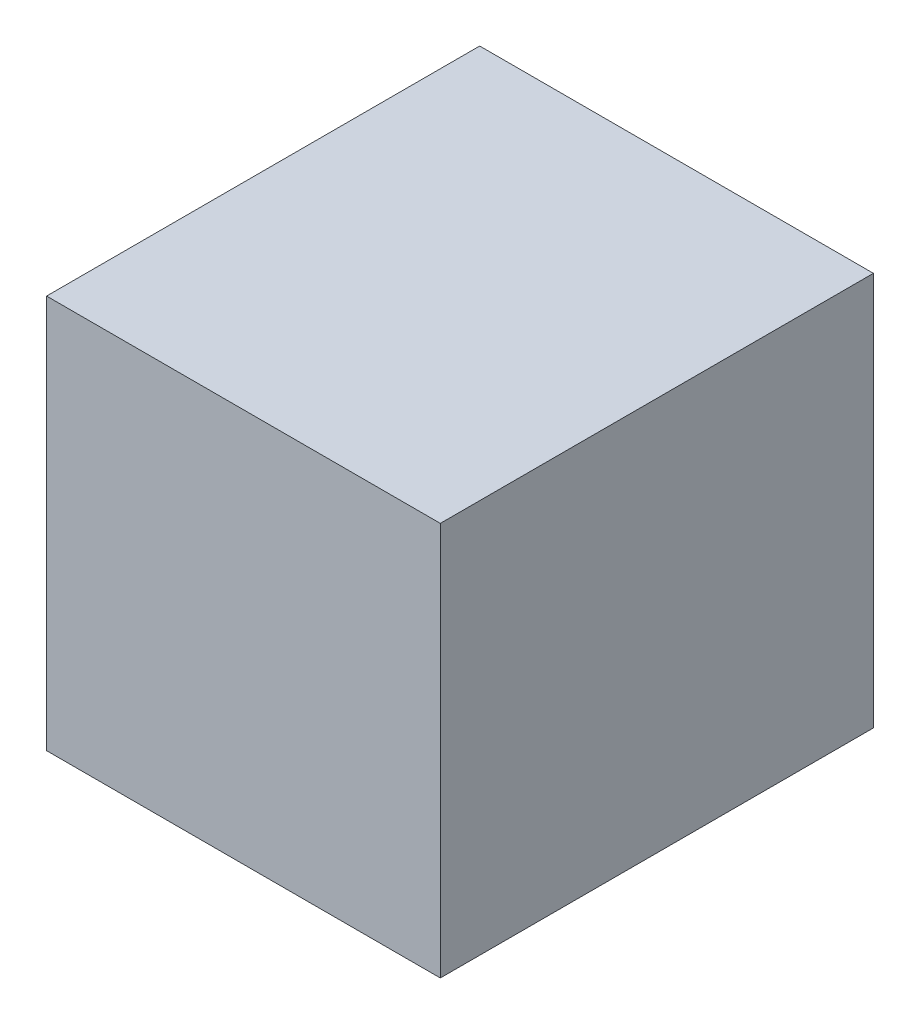
ISO-10303-21;
HEADER;
FILE_DESCRIPTION(('STEP AP214'),'2;1');
FILE_NAME('part.step','',(''),(''),'','','');
FILE_SCHEMA(('AUTOMOTIVE_DESIGN { 1 0 10303 214 1 1 1 1 }'));
ENDSEC;
DATA;
#1=APPLICATION_CONTEXT('core data for automotive mechanical design processes');
#2=APPLICATION_PROTOCOL_DEFINITION('international standard','automotive_design',2000,#1);
#3=PRODUCT_CONTEXT('',#1,'mechanical');
#4=PRODUCT('Part','Part','',(#3));
#5=PRODUCT_RELATED_PRODUCT_CATEGORY('part','',(#4));
#6=PRODUCT_DEFINITION_FORMATION('','',#4);
#7=PRODUCT_DEFINITION_CONTEXT('part definition',#1,'design');
#8=PRODUCT_DEFINITION('design','',#6,#7);
#9=PRODUCT_DEFINITION_SHAPE('','',#8);
#10=(LENGTH_UNIT() NAMED_UNIT(*) SI_UNIT(.MILLI.,.METRE.));
#11=(NAMED_UNIT(*) PLANE_ANGLE_UNIT() SI_UNIT($,.RADIAN.));
#12=(NAMED_UNIT(*) SI_UNIT($,.STERADIAN.) SOLID_ANGLE_UNIT());
#13=UNCERTAINTY_MEASURE_WITH_UNIT(LENGTH_MEASURE(1.E-05),#10,'distance_accuracy_value','');
#14=(GEOMETRIC_REPRESENTATION_CONTEXT(3) GLOBAL_UNCERTAINTY_ASSIGNED_CONTEXT((#13)) GLOBAL_UNIT_ASSIGNED_CONTEXT((#10,
#11,#12)) REPRESENTATION_CONTEXT('',''));
#15=CARTESIAN_POINT('',(0.,0.,0.));
#16=DIRECTION('',(0.,0.,1.));
#17=DIRECTION('',(1.,0.,0.));
#18=AXIS2_PLACEMENT_3D('',#15,#16,#17);
#19=CARTESIAN_POINT('',(180.,200.,-248.));
#20=DIRECTION('',(-1.,0.,0.));
#21=DIRECTION('',(0.,0.,1.));
#22=AXIS2_PLACEMENT_3D('',#19,#20,#21);
#23=PLANE('',#22);
#24=DIRECTION('',(0.,-1.,0.));
#25=VECTOR('',#24,1.);
#26=CARTESIAN_POINT('',(180.,200.,-138.));
#27=LINE('',#26,#25);
#28=CARTESIAN_POINT('',(180.,300.,-138.));
#29=VERTEX_POINT('',#28);
#30=CARTESIAN_POINT('',(180.,200.,-138.));
#31=VERTEX_POINT('',#30);
#32=EDGE_CURVE('E103',#29,#31,#27,.T.);
#33=ORIENTED_EDGE('',*,*,#32,.F.);
#34=DIRECTION('',(0.,0.,1.));
#35=VECTOR('',#34,1.);
#36=CARTESIAN_POINT('',(180.,300.,-248.));
#37=LINE('',#36,#35);
#38=CARTESIAN_POINT('',(180.,300.,-248.));
#39=VERTEX_POINT('',#38);
#40=EDGE_CURVE('E11',#39,#29,#37,.T.);
#41=ORIENTED_EDGE('',*,*,#40,.F.);
#42=DIRECTION('',(0.,-1.,0.));
#43=VECTOR('',#42,1.);
#44=CARTESIAN_POINT('',(180.,200.,-248.));
#45=LINE('',#44,#43);
#46=CARTESIAN_POINT('',(180.,200.,-248.));
#47=VERTEX_POINT('',#46);
#48=EDGE_CURVE('E97',#39,#47,#45,.T.);
#49=ORIENTED_EDGE('',*,*,#48,.T.);
#50=DIRECTION('',(0.,0.,1.));
#51=VECTOR('',#50,1.);
#52=CARTESIAN_POINT('',(180.,200.,-248.));
#53=LINE('',#52,#51);
#54=EDGE_CURVE('E42',#47,#31,#53,.T.);
#55=ORIENTED_EDGE('',*,*,#54,.T.);
#56=EDGE_LOOP('',(#33,#41,#49,#55));
#57=FACE_BOUND('',#56,.T.);
#58=ADVANCED_FACE('F39',(#57),#23,.T.);
#59=CARTESIAN_POINT('',(180.,300.,-248.));
#60=DIRECTION('',(0.,1.,0.));
#61=DIRECTION('',(0.,0.,1.));
#62=AXIS2_PLACEMENT_3D('',#59,#60,#61);
#63=PLANE('',#62);
#64=DIRECTION('',(-1.,0.,0.));
#65=VECTOR('',#64,1.);
#66=CARTESIAN_POINT('',(180.,300.,-138.));
#67=LINE('',#66,#65);
#68=CARTESIAN_POINT('',(280.,300.,-138.));
#69=VERTEX_POINT('',#68);
#70=EDGE_CURVE('E99',#69,#29,#67,.T.);
#71=ORIENTED_EDGE('',*,*,#70,.F.);
#72=DIRECTION('',(0.,0.,1.));
#73=VECTOR('',#72,1.);
#74=CARTESIAN_POINT('',(280.,300.,-248.));
#75=LINE('',#74,#73);
#76=CARTESIAN_POINT('',(280.,300.,-248.));
#77=VERTEX_POINT('',#76);
#78=EDGE_CURVE('E48',#77,#69,#75,.T.);
#79=ORIENTED_EDGE('',*,*,#78,.F.);
#80=DIRECTION('',(-1.,0.,0.));
#81=VECTOR('',#80,1.);
#82=CARTESIAN_POINT('',(180.,300.,-248.));
#83=LINE('',#82,#81);
#84=EDGE_CURVE('E94',#77,#39,#83,.T.);
#85=ORIENTED_EDGE('',*,*,#84,.T.);
#86=ORIENTED_EDGE('',*,*,#40,.T.);
#87=EDGE_LOOP('',(#71,#79,#85,#86));
#88=FACE_BOUND('',#87,.T.);
#89=ADVANCED_FACE('F113',(#88),#63,.T.);
#90=CARTESIAN_POINT('',(280.,200.,-248.));
#91=DIRECTION('',(1.,0.,0.));
#92=DIRECTION('',(0.,0.,-1.));
#93=AXIS2_PLACEMENT_3D('',#90,#91,#92);
#94=PLANE('',#93);
#95=DIRECTION('',(0.,1.,0.));
#96=VECTOR('',#95,1.);
#97=CARTESIAN_POINT('',(280.,200.,-138.));
#98=LINE('',#97,#96);
#99=CARTESIAN_POINT('',(280.,200.,-138.));
#100=VERTEX_POINT('',#99);
#101=EDGE_CURVE('E89',#100,#69,#98,.T.);
#102=ORIENTED_EDGE('',*,*,#101,.F.);
#103=DIRECTION('',(0.,0.,1.));
#104=VECTOR('',#103,1.);
#105=CARTESIAN_POINT('',(280.,200.,-248.));
#106=LINE('',#105,#104);
#107=CARTESIAN_POINT('',(280.,200.,-248.));
#108=VERTEX_POINT('',#107);
#109=EDGE_CURVE('E84',#108,#100,#106,.T.);
#110=ORIENTED_EDGE('',*,*,#109,.F.);
#111=DIRECTION('',(0.,1.,0.));
#112=VECTOR('',#111,1.);
#113=CARTESIAN_POINT('',(280.,200.,-248.));
#114=LINE('',#113,#112);
#115=EDGE_CURVE('E87',#108,#77,#114,.T.);
#116=ORIENTED_EDGE('',*,*,#115,.T.);
#117=ORIENTED_EDGE('',*,*,#78,.T.);
#118=EDGE_LOOP('',(#102,#110,#116,#117));
#119=FACE_BOUND('',#118,.T.);
#120=ADVANCED_FACE('F86',(#119),#94,.T.);
#121=CARTESIAN_POINT('',(180.,200.,-248.));
#122=DIRECTION('',(0.,-1.,0.));
#123=DIRECTION('',(0.,0.,-1.));
#124=AXIS2_PLACEMENT_3D('',#121,#122,#123);
#125=PLANE('',#124);
#126=DIRECTION('',(1.,0.,0.));
#127=VECTOR('',#126,1.);
#128=CARTESIAN_POINT('',(180.,200.,-138.));
#129=LINE('',#128,#127);
#130=EDGE_CURVE('E106',#31,#100,#129,.T.);
#131=ORIENTED_EDGE('',*,*,#130,.F.);
#132=ORIENTED_EDGE('',*,*,#54,.F.);
#133=DIRECTION('',(1.,0.,0.));
#134=VECTOR('',#133,1.);
#135=CARTESIAN_POINT('',(180.,200.,-248.));
#136=LINE('',#135,#134);
#137=EDGE_CURVE('E93',#47,#108,#136,.T.);
#138=ORIENTED_EDGE('',*,*,#137,.T.);
#139=ORIENTED_EDGE('',*,*,#109,.T.);
#140=EDGE_LOOP('',(#131,#132,#138,#139));
#141=FACE_BOUND('',#140,.T.);
#142=ADVANCED_FACE('F96',(#141),#125,.T.);
#143=CARTESIAN_POINT('',(0.,0.,-248.));
#144=DIRECTION('',(0.,0.,-1.));
#145=DIRECTION('',(-1.,0.,0.));
#146=AXIS2_PLACEMENT_3D('',#143,#144,#145);
#147=PLANE('',#146);
#148=ORIENTED_EDGE('',*,*,#48,.F.);
#149=ORIENTED_EDGE('',*,*,#84,.F.);
#150=ORIENTED_EDGE('',*,*,#115,.F.);
#151=ORIENTED_EDGE('',*,*,#137,.F.);
#152=EDGE_LOOP('',(#148,#149,#150,#151));
#153=FACE_BOUND('',#152,.T.);
#154=ADVANCED_FACE('F92',(#153),#147,.T.);
#155=CARTESIAN_POINT('',(0.,0.,-138.));
#156=DIRECTION('',(0.,0.,-1.));
#157=DIRECTION('',(-1.,0.,0.));
#158=AXIS2_PLACEMENT_3D('',#155,#156,#157);
#159=PLANE('',#158);
#160=ORIENTED_EDGE('',*,*,#32,.T.);
#161=ORIENTED_EDGE('',*,*,#130,.T.);
#162=ORIENTED_EDGE('',*,*,#101,.T.);
#163=ORIENTED_EDGE('',*,*,#70,.T.);
#164=EDGE_LOOP('',(#160,#161,#162,#163));
#165=FACE_BOUND('',#164,.T.);
#166=ADVANCED_FACE('F112',(#165),#159,.F.);
#167=CLOSED_SHELL('',(#58,#89,#120,#142,#154,#166));
#168=MANIFOLD_SOLID_BREP('B2',#167);
#169=ADVANCED_BREP_SHAPE_REPRESENTATION('',(#18,#168),#14);
#170=SHAPE_DEFINITION_REPRESENTATION(#9,#169);
ENDSEC;
END-ISO-10303-21;
